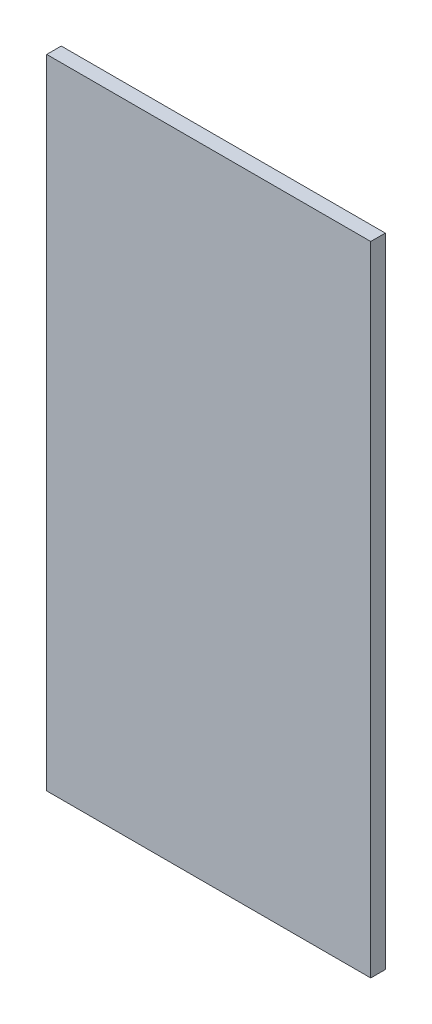
ISO-10303-21;
HEADER;
FILE_DESCRIPTION(('STEP AP214'),'2;1');
FILE_NAME('part.step','',(''),(''),'','','');
FILE_SCHEMA(('AUTOMOTIVE_DESIGN { 1 0 10303 214 1 1 1 1 }'));
ENDSEC;
DATA;
#1=APPLICATION_CONTEXT('core data for automotive mechanical design processes');
#2=APPLICATION_PROTOCOL_DEFINITION('international standard','automotive_design',2000,#1);
#3=PRODUCT_CONTEXT('',#1,'mechanical');
#4=PRODUCT('Part','Part','',(#3));
#5=PRODUCT_RELATED_PRODUCT_CATEGORY('part','',(#4));
#6=PRODUCT_DEFINITION_FORMATION('','',#4);
#7=PRODUCT_DEFINITION_CONTEXT('part definition',#1,'design');
#8=PRODUCT_DEFINITION('design','',#6,#7);
#9=PRODUCT_DEFINITION_SHAPE('','',#8);
#10=(LENGTH_UNIT() NAMED_UNIT(*) SI_UNIT(.MILLI.,.METRE.));
#11=(NAMED_UNIT(*) PLANE_ANGLE_UNIT() SI_UNIT($,.RADIAN.));
#12=(NAMED_UNIT(*) SI_UNIT($,.STERADIAN.) SOLID_ANGLE_UNIT());
#13=UNCERTAINTY_MEASURE_WITH_UNIT(LENGTH_MEASURE(1.E-05),#10,'distance_accuracy_value','');
#14=(GEOMETRIC_REPRESENTATION_CONTEXT(3) GLOBAL_UNCERTAINTY_ASSIGNED_CONTEXT((#13)) GLOBAL_UNIT_ASSIGNED_CONTEXT((#10,
#11,#12)) REPRESENTATION_CONTEXT('',''));
#15=CARTESIAN_POINT('',(0.,0.,0.));
#16=DIRECTION('',(0.,0.,1.));
#17=DIRECTION('',(1.,0.,0.));
#18=AXIS2_PLACEMENT_3D('',#15,#16,#17);
#19=CARTESIAN_POINT('',(-33.4149271968232,-65.7746461663782,3.));
#20=DIRECTION('',(1.,0.,0.));
#21=DIRECTION('',(0.,0.,-1.));
#22=AXIS2_PLACEMENT_3D('',#19,#20,#21);
#23=PLANE('',#22);
#24=DIRECTION('',(0.,-1.,0.));
#25=VECTOR('',#24,1.);
#26=CARTESIAN_POINT('',(-33.4149271968232,-65.7746461663782,0.));
#27=LINE('',#26,#25);
#28=CARTESIAN_POINT('',(-33.4149271968232,65.7746461663782,0.));
#29=VERTEX_POINT('',#28);
#30=CARTESIAN_POINT('',(-33.4149271968232,-65.7746461663782,0.));
#31=VERTEX_POINT('',#30);
#32=EDGE_CURVE('E111',#29,#31,#27,.T.);
#33=ORIENTED_EDGE('',*,*,#32,.T.);
#34=DIRECTION('',(0.,0.,-1.));
#35=VECTOR('',#34,1.);
#36=CARTESIAN_POINT('',(-33.4149271968232,-65.7746461663782,3.));
#37=LINE('',#36,#35);
#38=CARTESIAN_POINT('',(-33.4149271968232,-65.7746461663782,3.));
#39=VERTEX_POINT('',#38);
#40=EDGE_CURVE('E11',#39,#31,#37,.T.);
#41=ORIENTED_EDGE('',*,*,#40,.F.);
#42=DIRECTION('',(0.,-1.,0.));
#43=VECTOR('',#42,1.);
#44=CARTESIAN_POINT('',(-33.4149271968232,-65.7746461663782,3.));
#45=LINE('',#44,#43);
#46=CARTESIAN_POINT('',(-33.4149271968232,65.7746461663782,3.));
#47=VERTEX_POINT('',#46);
#48=EDGE_CURVE('E95',#47,#39,#45,.T.);
#49=ORIENTED_EDGE('',*,*,#48,.F.);
#50=DIRECTION('',(0.,0.,-1.));
#51=VECTOR('',#50,1.);
#52=CARTESIAN_POINT('',(-33.4149271968232,65.7746461663782,3.));
#53=LINE('',#52,#51);
#54=EDGE_CURVE('E107',#47,#29,#53,.T.);
#55=ORIENTED_EDGE('',*,*,#54,.T.);
#56=EDGE_LOOP('',(#33,#41,#49,#55));
#57=FACE_BOUND('',#56,.T.);
#58=ADVANCED_FACE('F43',(#57),#23,.F.);
#59=CARTESIAN_POINT('',(33.4149271968232,-65.7746461663782,3.));
#60=DIRECTION('',(0.,1.,0.));
#61=DIRECTION('',(0.,0.,1.));
#62=AXIS2_PLACEMENT_3D('',#59,#60,#61);
#63=PLANE('',#62);
#64=DIRECTION('',(1.,0.,0.));
#65=VECTOR('',#64,1.);
#66=CARTESIAN_POINT('',(33.4149271968232,-65.7746461663782,0.));
#67=LINE('',#66,#65);
#68=CARTESIAN_POINT('',(33.4149271968232,-65.7746461663782,0.));
#69=VERTEX_POINT('',#68);
#70=EDGE_CURVE('E100',#31,#69,#67,.T.);
#71=ORIENTED_EDGE('',*,*,#70,.T.);
#72=DIRECTION('',(0.,0.,-1.));
#73=VECTOR('',#72,1.);
#74=CARTESIAN_POINT('',(33.4149271968232,-65.7746461663782,3.));
#75=LINE('',#74,#73);
#76=CARTESIAN_POINT('',(33.4149271968232,-65.7746461663782,3.));
#77=VERTEX_POINT('',#76);
#78=EDGE_CURVE('E52',#77,#69,#75,.T.);
#79=ORIENTED_EDGE('',*,*,#78,.F.);
#80=DIRECTION('',(1.,0.,0.));
#81=VECTOR('',#80,1.);
#82=CARTESIAN_POINT('',(33.4149271968232,-65.7746461663782,3.));
#83=LINE('',#82,#81);
#84=EDGE_CURVE('E90',#39,#77,#83,.T.);
#85=ORIENTED_EDGE('',*,*,#84,.F.);
#86=ORIENTED_EDGE('',*,*,#40,.T.);
#87=EDGE_LOOP('',(#71,#79,#85,#86));
#88=FACE_BOUND('',#87,.T.);
#89=ADVANCED_FACE('F99',(#88),#63,.F.);
#90=CARTESIAN_POINT('',(33.4149271968232,-65.7746461663782,3.));
#91=DIRECTION('',(-1.,0.,0.));
#92=DIRECTION('',(0.,0.,1.));
#93=AXIS2_PLACEMENT_3D('',#90,#91,#92);
#94=PLANE('',#93);
#95=DIRECTION('',(0.,1.,0.));
#96=VECTOR('',#95,1.);
#97=CARTESIAN_POINT('',(33.4149271968232,-65.7746461663782,0.));
#98=LINE('',#97,#96);
#99=CARTESIAN_POINT('',(33.4149271968232,65.7746461663782,0.));
#100=VERTEX_POINT('',#99);
#101=EDGE_CURVE('E77',#69,#100,#98,.T.);
#102=ORIENTED_EDGE('',*,*,#101,.T.);
#103=DIRECTION('',(0.,0.,-1.));
#104=VECTOR('',#103,1.);
#105=CARTESIAN_POINT('',(33.4149271968232,65.7746461663782,3.));
#106=LINE('',#105,#104);
#107=CARTESIAN_POINT('',(33.4149271968232,65.7746461663782,3.));
#108=VERTEX_POINT('',#107);
#109=EDGE_CURVE('E102',#108,#100,#106,.T.);
#110=ORIENTED_EDGE('',*,*,#109,.F.);
#111=DIRECTION('',(0.,1.,0.));
#112=VECTOR('',#111,1.);
#113=CARTESIAN_POINT('',(33.4149271968232,-65.7746461663782,3.));
#114=LINE('',#113,#112);
#115=EDGE_CURVE('E93',#77,#108,#114,.T.);
#116=ORIENTED_EDGE('',*,*,#115,.F.);
#117=ORIENTED_EDGE('',*,*,#78,.T.);
#118=EDGE_LOOP('',(#102,#110,#116,#117));
#119=FACE_BOUND('',#118,.T.);
#120=ADVANCED_FACE('F103',(#119),#94,.F.);
#121=CARTESIAN_POINT('',(33.4149271968232,65.7746461663782,3.));
#122=DIRECTION('',(0.,-1.,0.));
#123=DIRECTION('',(0.,0.,-1.));
#124=AXIS2_PLACEMENT_3D('',#121,#122,#123);
#125=PLANE('',#124);
#126=DIRECTION('',(-1.,0.,0.));
#127=VECTOR('',#126,1.);
#128=CARTESIAN_POINT('',(33.4149271968232,65.7746461663782,0.));
#129=LINE('',#128,#127);
#130=EDGE_CURVE('E83',#100,#29,#129,.T.);
#131=ORIENTED_EDGE('',*,*,#130,.T.);
#132=ORIENTED_EDGE('',*,*,#54,.F.);
#133=DIRECTION('',(-1.,0.,0.));
#134=VECTOR('',#133,1.);
#135=CARTESIAN_POINT('',(33.4149271968232,65.7746461663782,3.));
#136=LINE('',#135,#134);
#137=EDGE_CURVE('E60',#108,#47,#136,.T.);
#138=ORIENTED_EDGE('',*,*,#137,.F.);
#139=ORIENTED_EDGE('',*,*,#109,.T.);
#140=EDGE_LOOP('',(#131,#132,#138,#139));
#141=FACE_BOUND('',#140,.T.);
#142=ADVANCED_FACE('F124',(#141),#125,.F.);
#143=CARTESIAN_POINT('',(0.,0.,3.));
#144=DIRECTION('',(0.,0.,1.));
#145=DIRECTION('',(1.,0.,0.));
#146=AXIS2_PLACEMENT_3D('',#143,#144,#145);
#147=PLANE('',#146);
#148=ORIENTED_EDGE('',*,*,#48,.T.);
#149=ORIENTED_EDGE('',*,*,#84,.T.);
#150=ORIENTED_EDGE('',*,*,#115,.T.);
#151=ORIENTED_EDGE('',*,*,#137,.T.);
#152=EDGE_LOOP('',(#148,#149,#150,#151));
#153=FACE_BOUND('',#152,.T.);
#154=ADVANCED_FACE('F91',(#153),#147,.T.);
#155=CARTESIAN_POINT('',(0.,0.,0.));
#156=DIRECTION('',(0.,0.,1.));
#157=DIRECTION('',(1.,0.,0.));
#158=AXIS2_PLACEMENT_3D('',#155,#156,#157);
#159=PLANE('',#158);
#160=ORIENTED_EDGE('',*,*,#32,.F.);
#161=ORIENTED_EDGE('',*,*,#130,.F.);
#162=ORIENTED_EDGE('',*,*,#101,.F.);
#163=ORIENTED_EDGE('',*,*,#70,.F.);
#164=EDGE_LOOP('',(#160,#161,#162,#163));
#165=FACE_BOUND('',#164,.T.);
#166=ADVANCED_FACE('F127',(#165),#159,.F.);
#167=CLOSED_SHELL('',(#58,#89,#120,#142,#154,#166));
#168=MANIFOLD_SOLID_BREP('B2',#167);
#169=ADVANCED_BREP_SHAPE_REPRESENTATION('',(#18,#168),#14);
#170=SHAPE_DEFINITION_REPRESENTATION(#9,#169);
ENDSEC;
END-ISO-10303-21;
